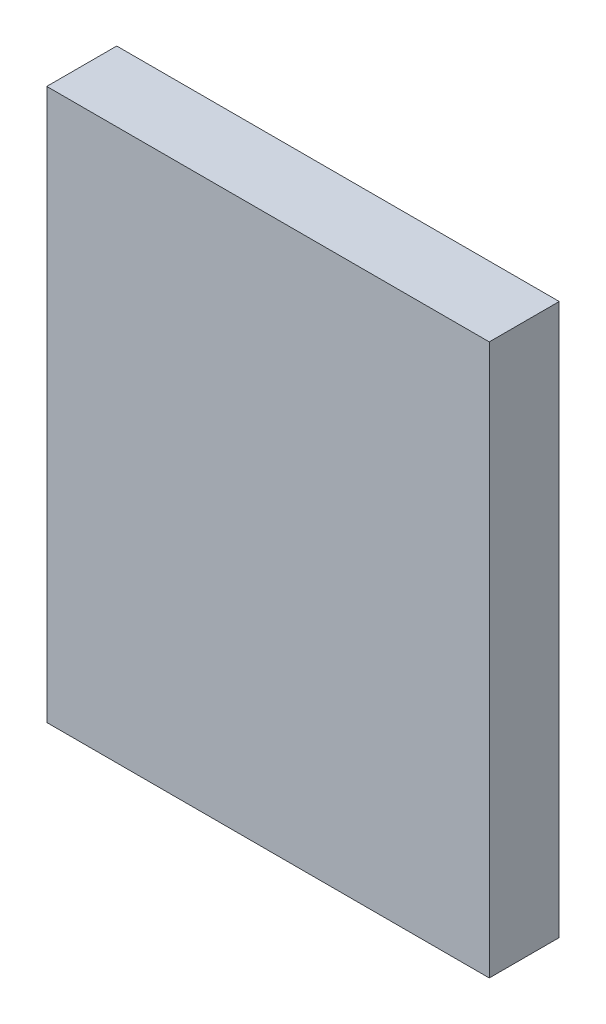
ISO-10303-21;
HEADER;
FILE_DESCRIPTION(('STEP AP214'),'2;1');
FILE_NAME('part.step','',(''),(''),'','','');
FILE_SCHEMA(('AUTOMOTIVE_DESIGN { 1 0 10303 214 1 1 1 1 }'));
ENDSEC;
DATA;
#1=APPLICATION_CONTEXT('core data for automotive mechanical design processes');
#2=APPLICATION_PROTOCOL_DEFINITION('international standard','automotive_design',2000,#1);
#3=PRODUCT_CONTEXT('',#1,'mechanical');
#4=PRODUCT('Part','Part','',(#3));
#5=PRODUCT_RELATED_PRODUCT_CATEGORY('part','',(#4));
#6=PRODUCT_DEFINITION_FORMATION('','',#4);
#7=PRODUCT_DEFINITION_CONTEXT('part definition',#1,'design');
#8=PRODUCT_DEFINITION('design','',#6,#7);
#9=PRODUCT_DEFINITION_SHAPE('','',#8);
#10=(LENGTH_UNIT() NAMED_UNIT(*) SI_UNIT(.MILLI.,.METRE.));
#11=(NAMED_UNIT(*) PLANE_ANGLE_UNIT() SI_UNIT($,.RADIAN.));
#12=(NAMED_UNIT(*) SI_UNIT($,.STERADIAN.) SOLID_ANGLE_UNIT());
#13=UNCERTAINTY_MEASURE_WITH_UNIT(LENGTH_MEASURE(1.E-05),#10,'distance_accuracy_value','');
#14=(GEOMETRIC_REPRESENTATION_CONTEXT(3) GLOBAL_UNCERTAINTY_ASSIGNED_CONTEXT((#13)) GLOBAL_UNIT_ASSIGNED_CONTEXT((#10,
#11,#12)) REPRESENTATION_CONTEXT('',''));
#15=CARTESIAN_POINT('',(0.,0.,0.));
#16=DIRECTION('',(0.,0.,1.));
#17=DIRECTION('',(1.,0.,0.));
#18=AXIS2_PLACEMENT_3D('',#15,#16,#17);
#19=CARTESIAN_POINT('',(-2.40982981966,-2.999987299975,0.762001524003));
#20=DIRECTION('',(0.,0.,1.));
#21=DIRECTION('',(1.,0.,0.));
#22=AXIS2_PLACEMENT_3D('',#19,#20,#21);
#23=PLANE('',#22);
#24=DIRECTION('',(0.,-1.,0.));
#25=VECTOR('',#24,1.);
#26=CARTESIAN_POINT('',(2.40985521971,1.27000249999613E-05,0.762001524003));
#27=LINE('',#26,#25);
#28=CARTESIAN_POINT('',(2.40985521971,3.000012700025,0.762001524003));
#29=VERTEX_POINT('',#28);
#30=CARTESIAN_POINT('',(2.40985521971,-2.999987299975,0.762001524003));
#31=VERTEX_POINT('',#30);
#32=EDGE_CURVE('E77',#29,#31,#27,.T.);
#33=ORIENTED_EDGE('',*,*,#32,.F.);
#34=DIRECTION('',(1.,0.,0.));
#35=VECTOR('',#34,1.);
#36=CARTESIAN_POINT('',(1.27000249999613E-05,3.000012700025,0.762001524003));
#37=LINE('',#36,#35);
#38=CARTESIAN_POINT('',(-2.40982981966,3.000012700025,0.762001524003));
#39=VERTEX_POINT('',#38);
#40=EDGE_CURVE('E59',#39,#29,#37,.T.);
#41=ORIENTED_EDGE('',*,*,#40,.F.);
#42=DIRECTION('',(0.,-1.,0.));
#43=VECTOR('',#42,1.);
#44=CARTESIAN_POINT('',(-2.40982981966,1.27000249999613E-05,0.762001524003));
#45=LINE('',#44,#43);
#46=CARTESIAN_POINT('',(-2.40982981966,-2.999987299975,0.762001524003));
#47=VERTEX_POINT('',#46);
#48=EDGE_CURVE('E21',#39,#47,#45,.T.);
#49=ORIENTED_EDGE('',*,*,#48,.T.);
#50=DIRECTION('',(1.,0.,0.));
#51=VECTOR('',#50,1.);
#52=CARTESIAN_POINT('',(1.27000249999613E-05,-2.999987299975,0.762001524003));
#53=LINE('',#52,#51);
#54=EDGE_CURVE('E56',#47,#31,#53,.T.);
#55=ORIENTED_EDGE('',*,*,#54,.T.);
#56=EDGE_LOOP('',(#33,#41,#49,#55));
#57=FACE_BOUND('',#56,.T.);
#58=ADVANCED_FACE('F17',(#57),#23,.T.);
#59=CARTESIAN_POINT('',(-2.40982981966,3.000012700025,0.));
#60=DIRECTION('',(1.,0.,0.));
#61=DIRECTION('',(0.,0.,1.));
#62=AXIS2_PLACEMENT_3D('',#59,#60,#61);
#63=PLANE('',#62);
#64=DIRECTION('',(0.,0.,1.));
#65=VECTOR('',#64,1.);
#66=CARTESIAN_POINT('',(-2.40982981966,3.000012700025,0.3810007620015));
#67=LINE('',#66,#65);
#68=CARTESIAN_POINT('',(-2.40982981966,3.000012700025,0.));
#69=VERTEX_POINT('',#68);
#70=EDGE_CURVE('E79',#69,#39,#67,.T.);
#71=ORIENTED_EDGE('',*,*,#70,.F.);
#72=DIRECTION('',(0.,-1.,0.));
#73=VECTOR('',#72,1.);
#74=CARTESIAN_POINT('',(-2.40982981966,1.27000249999613E-05,0.));
#75=LINE('',#74,#73);
#76=CARTESIAN_POINT('',(-2.40982981966,-2.999987299975,0.));
#77=VERTEX_POINT('',#76);
#78=EDGE_CURVE('E74',#69,#77,#75,.T.);
#79=ORIENTED_EDGE('',*,*,#78,.T.);
#80=DIRECTION('',(0.,0.,1.));
#81=VECTOR('',#80,1.);
#82=CARTESIAN_POINT('',(-2.40982981966,-2.999987299975,0.3810007620015));
#83=LINE('',#82,#81);
#84=EDGE_CURVE('E64',#77,#47,#83,.T.);
#85=ORIENTED_EDGE('',*,*,#84,.T.);
#86=ORIENTED_EDGE('',*,*,#48,.F.);
#87=EDGE_LOOP('',(#71,#79,#85,#86));
#88=FACE_BOUND('',#87,.T.);
#89=ADVANCED_FACE('F73',(#88),#63,.F.);
#90=CARTESIAN_POINT('',(-2.40982981966,-2.999987299975,0.));
#91=DIRECTION('',(0.,1.,0.));
#92=DIRECTION('',(0.,0.,1.));
#93=AXIS2_PLACEMENT_3D('',#90,#91,#92);
#94=PLANE('',#93);
#95=ORIENTED_EDGE('',*,*,#54,.F.);
#96=ORIENTED_EDGE('',*,*,#84,.F.);
#97=DIRECTION('',(1.,0.,0.));
#98=VECTOR('',#97,1.);
#99=CARTESIAN_POINT('',(1.27000249999613E-05,-2.999987299975,0.));
#100=LINE('',#99,#98);
#101=CARTESIAN_POINT('',(2.40985521971,-2.999987299975,0.));
#102=VERTEX_POINT('',#101);
#103=EDGE_CURVE('E84',#77,#102,#100,.T.);
#104=ORIENTED_EDGE('',*,*,#103,.T.);
#105=DIRECTION('',(0.,0.,-1.));
#106=VECTOR('',#105,1.);
#107=CARTESIAN_POINT('',(2.40985521971,-2.999987299975,0.3810007620015));
#108=LINE('',#107,#106);
#109=EDGE_CURVE('E70',#31,#102,#108,.T.);
#110=ORIENTED_EDGE('',*,*,#109,.F.);
#111=EDGE_LOOP('',(#95,#96,#104,#110));
#112=FACE_BOUND('',#111,.T.);
#113=ADVANCED_FACE('F67',(#112),#94,.F.);
#114=CARTESIAN_POINT('',(2.40985521971,3.000012700025,0.));
#115=DIRECTION('',(1.,0.,0.));
#116=DIRECTION('',(0.,0.,1.));
#117=AXIS2_PLACEMENT_3D('',#114,#115,#116);
#118=PLANE('',#117);
#119=DIRECTION('',(0.,0.,-1.));
#120=VECTOR('',#119,1.);
#121=CARTESIAN_POINT('',(2.40985521971,3.000012700025,0.3810007620015));
#122=LINE('',#121,#120);
#123=CARTESIAN_POINT('',(2.40985521971,3.000012700025,0.));
#124=VERTEX_POINT('',#123);
#125=EDGE_CURVE('E35',#29,#124,#122,.T.);
#126=ORIENTED_EDGE('',*,*,#125,.F.);
#127=ORIENTED_EDGE('',*,*,#32,.T.);
#128=ORIENTED_EDGE('',*,*,#109,.T.);
#129=DIRECTION('',(0.,1.,0.));
#130=VECTOR('',#129,1.);
#131=CARTESIAN_POINT('',(2.40985521971,1.27000249999613E-05,0.));
#132=LINE('',#131,#130);
#133=EDGE_CURVE('E27',#102,#124,#132,.T.);
#134=ORIENTED_EDGE('',*,*,#133,.T.);
#135=EDGE_LOOP('',(#126,#127,#128,#134));
#136=FACE_BOUND('',#135,.T.);
#137=ADVANCED_FACE('F89',(#136),#118,.T.);
#138=CARTESIAN_POINT('',(-2.40982981966,3.000012700025,0.));
#139=DIRECTION('',(0.,1.,0.));
#140=DIRECTION('',(0.,0.,1.));
#141=AXIS2_PLACEMENT_3D('',#138,#139,#140);
#142=PLANE('',#141);
#143=ORIENTED_EDGE('',*,*,#40,.T.);
#144=ORIENTED_EDGE('',*,*,#125,.T.);
#145=DIRECTION('',(-1.,0.,0.));
#146=VECTOR('',#145,1.);
#147=CARTESIAN_POINT('',(1.27000249999613E-05,3.000012700025,0.));
#148=LINE('',#147,#146);
#149=EDGE_CURVE('E11',#124,#69,#148,.T.);
#150=ORIENTED_EDGE('',*,*,#149,.T.);
#151=ORIENTED_EDGE('',*,*,#70,.T.);
#152=EDGE_LOOP('',(#143,#144,#150,#151));
#153=FACE_BOUND('',#152,.T.);
#154=ADVANCED_FACE('F91',(#153),#142,.T.);
#155=CARTESIAN_POINT('',(-2.40982981966,-2.999987299975,0.));
#156=DIRECTION('',(0.,0.,1.));
#157=DIRECTION('',(1.,0.,0.));
#158=AXIS2_PLACEMENT_3D('',#155,#156,#157);
#159=PLANE('',#158);
#160=ORIENTED_EDGE('',*,*,#133,.F.);
#161=ORIENTED_EDGE('',*,*,#103,.F.);
#162=ORIENTED_EDGE('',*,*,#78,.F.);
#163=ORIENTED_EDGE('',*,*,#149,.F.);
#164=EDGE_LOOP('',(#160,#161,#162,#163));
#165=FACE_BOUND('',#164,.T.);
#166=ADVANCED_FACE('F19',(#165),#159,.F.);
#167=CLOSED_SHELL('',(#58,#89,#113,#137,#154,#166));
#168=MANIFOLD_SOLID_BREP('B1',#167);
#169=ADVANCED_BREP_SHAPE_REPRESENTATION('',(#18,#168),#14);
#170=SHAPE_DEFINITION_REPRESENTATION(#9,#169);
ENDSEC;
END-ISO-10303-21;
